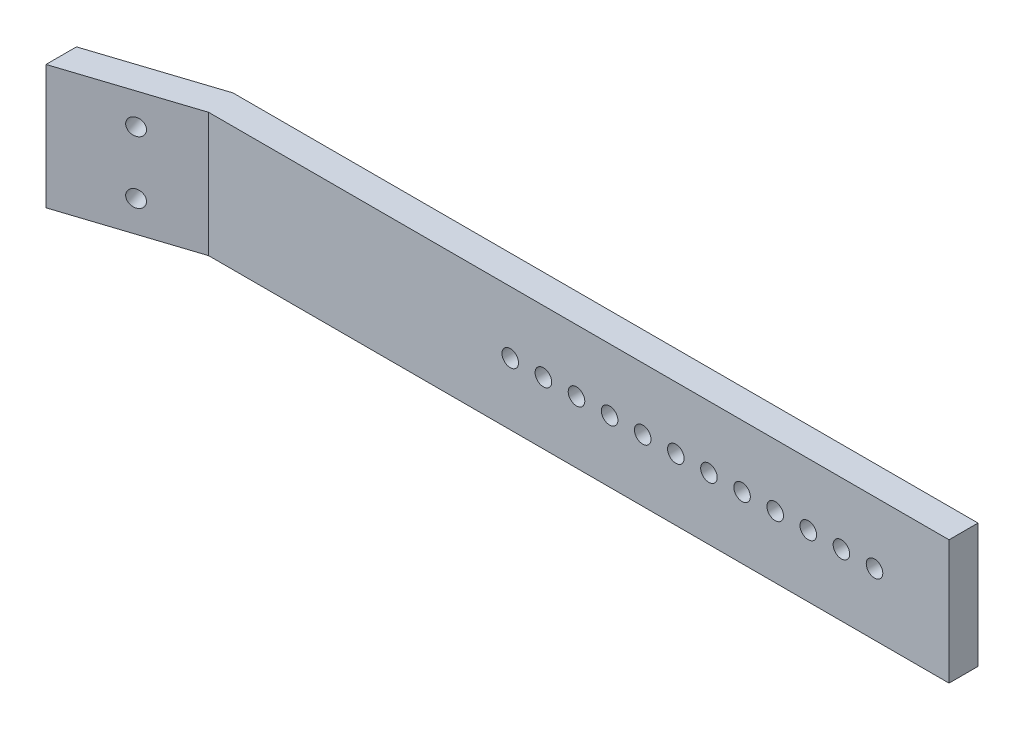
ISO-10303-21;
HEADER;
FILE_DESCRIPTION(('STEP AP214'),'2;1');
FILE_NAME('part.step','',(''),(''),'','','');
FILE_SCHEMA(('AUTOMOTIVE_DESIGN { 1 0 10303 214 1 1 1 1 }'));
ENDSEC;
DATA;
#1=APPLICATION_CONTEXT('core data for automotive mechanical design processes');
#2=APPLICATION_PROTOCOL_DEFINITION('international standard','automotive_design',2000,#1);
#3=PRODUCT_CONTEXT('',#1,'mechanical');
#4=PRODUCT('Part','Part','',(#3));
#5=PRODUCT_RELATED_PRODUCT_CATEGORY('part','',(#4));
#6=PRODUCT_DEFINITION_FORMATION('','',#4);
#7=PRODUCT_DEFINITION_CONTEXT('part definition',#1,'design');
#8=PRODUCT_DEFINITION('design','',#6,#7);
#9=PRODUCT_DEFINITION_SHAPE('','',#8);
#10=(LENGTH_UNIT() NAMED_UNIT(*) SI_UNIT(.MILLI.,.METRE.));
#11=(NAMED_UNIT(*) PLANE_ANGLE_UNIT() SI_UNIT($,.RADIAN.));
#12=(NAMED_UNIT(*) SI_UNIT($,.STERADIAN.) SOLID_ANGLE_UNIT());
#13=UNCERTAINTY_MEASURE_WITH_UNIT(LENGTH_MEASURE(1.E-05),#10,'distance_accuracy_value','');
#14=(GEOMETRIC_REPRESENTATION_CONTEXT(3) GLOBAL_UNCERTAINTY_ASSIGNED_CONTEXT((#13)) GLOBAL_UNIT_ASSIGNED_CONTEXT((#10,
#11,#12)) REPRESENTATION_CONTEXT('',''));
#15=CARTESIAN_POINT('',(0.,0.,0.));
#16=DIRECTION('',(0.,0.,1.));
#17=DIRECTION('',(1.,0.,0.));
#18=AXIS2_PLACEMENT_3D('',#15,#16,#17);
#19=CARTESIAN_POINT('',(-115.,15.,50.));
#20=DIRECTION('',(0.,-1.,0.));
#21=DIRECTION('',(0.,0.,-1.));
#22=AXIS2_PLACEMENT_3D('',#19,#20,#21);
#23=PLANE('',#22);
#24=DIRECTION('',(0.951056516295154,0.,-0.309016994374948));
#25=VECTOR('',#24,1.);
#26=CARTESIAN_POINT('',(-124.806977866667,15.,19.8172256703166));
#27=LINE('',#26,#25);
#28=CARTESIAN_POINT('',(-115.,15.,16.6307454009163));
#29=VERTEX_POINT('',#28);
#30=CARTESIAN_POINT('',(-85.3596134288735,15.,7.));
#31=VERTEX_POINT('',#30);
#32=EDGE_CURVE('E94',#29,#31,#27,.T.);
#33=ORIENTED_EDGE('',*,*,#32,.T.);
#34=DIRECTION('',(1.,0.,0.));
#35=VECTOR('',#34,1.);
#36=CARTESIAN_POINT('',(-115.,15.,7.00000000000001));
#37=LINE('',#36,#35);
#38=CARTESIAN_POINT('',(93.5316954888547,15.,7.));
#39=VERTEX_POINT('',#38);
#40=EDGE_CURVE('E177',#31,#39,#37,.T.);
#41=ORIENTED_EDGE('',*,*,#40,.T.);
#42=DIRECTION('',(0.,0.,-1.));
#43=VECTOR('',#42,1.);
#44=CARTESIAN_POINT('',(93.5316954888547,15.,50.0000000000002));
#45=LINE('',#44,#43);
#46=CARTESIAN_POINT('',(93.5316954888547,15.,0.));
#47=VERTEX_POINT('',#46);
#48=EDGE_CURVE('E183',#39,#47,#45,.T.);
#49=ORIENTED_EDGE('',*,*,#48,.T.);
#50=DIRECTION('',(-1.,0.,0.));
#51=VECTOR('',#50,1.);
#52=CARTESIAN_POINT('',(-115.,15.,0.));
#53=LINE('',#52,#51);
#54=CARTESIAN_POINT('',(-86.4683045111453,15.,0.));
#55=VERTEX_POINT('',#54);
#56=EDGE_CURVE('E117',#47,#55,#53,.T.);
#57=ORIENTED_EDGE('',*,*,#56,.T.);
#58=DIRECTION('',(-0.951056516295154,0.,0.309016994374948));
#59=VECTOR('',#58,1.);
#60=CARTESIAN_POINT('',(-126.970096827292,15.,13.1598300562506));
#61=LINE('',#60,#59);
#62=CARTESIAN_POINT('',(-115.,15.,9.27050983124845));
#63=VERTEX_POINT('',#62);
#64=EDGE_CURVE('E188',#55,#63,#61,.T.);
#65=ORIENTED_EDGE('',*,*,#64,.T.);
#66=DIRECTION('',(0.,0.,-1.));
#67=VECTOR('',#66,1.);
#68=CARTESIAN_POINT('',(-115.,15.,50.));
#69=LINE('',#68,#67);
#70=EDGE_CURVE('E111',#29,#63,#69,.T.);
#71=ORIENTED_EDGE('',*,*,#70,.F.);
#72=EDGE_LOOP('',(#33,#41,#49,#57,#65,#71));
#73=FACE_BOUND('',#72,.T.);
#74=ADVANCED_FACE('F34',(#73),#23,.F.);
#75=CARTESIAN_POINT('',(-115.,15.,50.));
#76=DIRECTION('',(1.,0.,0.));
#77=DIRECTION('',(0.,0.,-1.));
#78=AXIS2_PLACEMENT_3D('',#75,#76,#77);
#79=PLANE('',#78);
#80=DIRECTION('',(0.,0.,-1.));
#81=VECTOR('',#80,1.);
#82=CARTESIAN_POINT('',(-115.,-15.,50.));
#83=LINE('',#82,#81);
#84=CARTESIAN_POINT('',(-115.,-15.,16.6307454009163));
#85=VERTEX_POINT('',#84);
#86=CARTESIAN_POINT('',(-115.,-15.,9.27050983124845));
#87=VERTEX_POINT('',#86);
#88=EDGE_CURVE('E103',#85,#87,#83,.T.);
#89=ORIENTED_EDGE('',*,*,#88,.F.);
#90=DIRECTION('',(0.,-1.,0.));
#91=VECTOR('',#90,1.);
#92=CARTESIAN_POINT('',(-115.,35.,16.6307454009163));
#93=LINE('',#92,#91);
#94=EDGE_CURVE('E88',#29,#85,#93,.T.);
#95=ORIENTED_EDGE('',*,*,#94,.F.);
#96=ORIENTED_EDGE('',*,*,#70,.T.);
#97=DIRECTION('',(0.,-1.,0.));
#98=VECTOR('',#97,1.);
#99=CARTESIAN_POINT('',(-115.,35.,9.27050983124845));
#100=LINE('',#99,#98);
#101=EDGE_CURVE('E110',#63,#87,#100,.T.);
#102=ORIENTED_EDGE('',*,*,#101,.T.);
#103=EDGE_LOOP('',(#89,#95,#96,#102));
#104=FACE_BOUND('',#103,.T.);
#105=ADVANCED_FACE('F108',(#104),#79,.F.);
#106=CARTESIAN_POINT('',(-115.,-15.,50.));
#107=DIRECTION('',(0.,1.,0.));
#108=DIRECTION('',(0.,0.,1.));
#109=AXIS2_PLACEMENT_3D('',#106,#107,#108);
#110=PLANE('',#109);
#111=DIRECTION('',(0.,0.,-1.));
#112=VECTOR('',#111,1.);
#113=CARTESIAN_POINT('',(93.5316954888547,-15.,0.));
#114=LINE('',#113,#112);
#115=CARTESIAN_POINT('',(93.5316954888547,-15.,7.));
#116=VERTEX_POINT('',#115);
#117=CARTESIAN_POINT('',(93.5316954888546,-15.,0.));
#118=VERTEX_POINT('',#117);
#119=EDGE_CURVE('E56',#116,#118,#114,.T.);
#120=ORIENTED_EDGE('',*,*,#119,.F.);
#121=DIRECTION('',(1.,0.,0.));
#122=VECTOR('',#121,1.);
#123=CARTESIAN_POINT('',(-85.3596134288735,-15.,7.));
#124=LINE('',#123,#122);
#125=CARTESIAN_POINT('',(-85.3596134288735,-15.,7.));
#126=VERTEX_POINT('',#125);
#127=EDGE_CURVE('E50',#126,#116,#124,.T.);
#128=ORIENTED_EDGE('',*,*,#127,.F.);
#129=DIRECTION('',(0.951056516295153,0.,-0.309016994374948));
#130=VECTOR('',#129,1.);
#131=CARTESIAN_POINT('',(-115.,-15.,16.6307454009163));
#132=LINE('',#131,#130);
#133=EDGE_CURVE('E92',#85,#126,#132,.T.);
#134=ORIENTED_EDGE('',*,*,#133,.F.);
#135=ORIENTED_EDGE('',*,*,#88,.T.);
#136=DIRECTION('',(-0.951056516295153,0.,0.309016994374948));
#137=VECTOR('',#136,1.);
#138=CARTESIAN_POINT('',(-115.,-15.,9.27050983124845));
#139=LINE('',#138,#137);
#140=CARTESIAN_POINT('',(-86.4683045111453,-15.,0.));
#141=VERTEX_POINT('',#140);
#142=EDGE_CURVE('E185',#141,#87,#139,.T.);
#143=ORIENTED_EDGE('',*,*,#142,.F.);
#144=DIRECTION('',(1.,0.,0.));
#145=VECTOR('',#144,1.);
#146=CARTESIAN_POINT('',(-115.,-15.,0.));
#147=LINE('',#146,#145);
#148=EDGE_CURVE('E112',#141,#118,#147,.T.);
#149=ORIENTED_EDGE('',*,*,#148,.T.);
#150=EDGE_LOOP('',(#120,#128,#134,#135,#143,#149));
#151=FACE_BOUND('',#150,.T.);
#152=ADVANCED_FACE('F101',(#151),#110,.F.);
#153=CARTESIAN_POINT('',(0.,0.,0.));
#154=DIRECTION('',(0.,0.,1.));
#155=DIRECTION('',(1.,0.,0.));
#156=AXIS2_PLACEMENT_3D('',#153,#154,#155);
#157=PLANE('',#156);
#158=CARTESIAN_POINT('',(-12.4683045111453,0.,0.));
#159=DIRECTION('',(0.,0.,-1.));
#160=DIRECTION('',(-1.,0.,0.));
#161=AXIS2_PLACEMENT_3D('',#158,#159,#160);
#162=CIRCLE('',#161,2.);
#163=CARTESIAN_POINT('',(-14.4683045111453,0.,0.));
#164=VERTEX_POINT('',#163);
#165=EDGE_CURVE('E392',#164,#164,#162,.T.);
#166=ORIENTED_EDGE('',*,*,#165,.F.);
#167=EDGE_LOOP('',(#166));
#168=FACE_BOUND('',#167,.T.);
#169=CARTESIAN_POINT('',(-4.46830451114529,0.,0.));
#170=DIRECTION('',(0.,0.,-1.));
#171=DIRECTION('',(-1.,0.,0.));
#172=AXIS2_PLACEMENT_3D('',#169,#170,#171);
#173=CIRCLE('',#172,2.);
#174=CARTESIAN_POINT('',(-6.46830451114529,0.,0.));
#175=VERTEX_POINT('',#174);
#176=EDGE_CURVE('E393',#175,#175,#173,.T.);
#177=ORIENTED_EDGE('',*,*,#176,.F.);
#178=EDGE_LOOP('',(#177));
#179=FACE_BOUND('',#178,.T.);
#180=CARTESIAN_POINT('',(3.53169548885471,0.,0.));
#181=DIRECTION('',(0.,0.,-1.));
#182=DIRECTION('',(-1.,0.,0.));
#183=AXIS2_PLACEMENT_3D('',#180,#181,#182);
#184=CIRCLE('',#183,2.);
#185=CARTESIAN_POINT('',(1.53169548885471,0.,0.));
#186=VERTEX_POINT('',#185);
#187=EDGE_CURVE('E396',#186,#186,#184,.T.);
#188=ORIENTED_EDGE('',*,*,#187,.F.);
#189=EDGE_LOOP('',(#188));
#190=FACE_BOUND('',#189,.T.);
#191=CARTESIAN_POINT('',(11.5316954888547,0.,0.));
#192=DIRECTION('',(0.,0.,-1.));
#193=DIRECTION('',(-1.,0.,0.));
#194=AXIS2_PLACEMENT_3D('',#191,#192,#193);
#195=CIRCLE('',#194,2.);
#196=CARTESIAN_POINT('',(9.53169548885472,0.,0.));
#197=VERTEX_POINT('',#196);
#198=EDGE_CURVE('E422',#197,#197,#195,.T.);
#199=ORIENTED_EDGE('',*,*,#198,.F.);
#200=EDGE_LOOP('',(#199));
#201=FACE_BOUND('',#200,.T.);
#202=CARTESIAN_POINT('',(19.5316954888547,0.,0.));
#203=DIRECTION('',(0.,0.,-1.));
#204=DIRECTION('',(-1.,0.,0.));
#205=AXIS2_PLACEMENT_3D('',#202,#203,#204);
#206=CIRCLE('',#205,2.);
#207=CARTESIAN_POINT('',(17.5316954888547,0.,0.));
#208=VERTEX_POINT('',#207);
#209=EDGE_CURVE('E419',#208,#208,#206,.T.);
#210=ORIENTED_EDGE('',*,*,#209,.F.);
#211=EDGE_LOOP('',(#210));
#212=FACE_BOUND('',#211,.T.);
#213=CARTESIAN_POINT('',(27.5316954888547,0.,0.));
#214=DIRECTION('',(0.,0.,-1.));
#215=DIRECTION('',(-1.,0.,0.));
#216=AXIS2_PLACEMENT_3D('',#213,#214,#215);
#217=CIRCLE('',#216,2.);
#218=CARTESIAN_POINT('',(25.5316954888547,0.,0.));
#219=VERTEX_POINT('',#218);
#220=EDGE_CURVE('E416',#219,#219,#217,.T.);
#221=ORIENTED_EDGE('',*,*,#220,.F.);
#222=EDGE_LOOP('',(#221));
#223=FACE_BOUND('',#222,.T.);
#224=CARTESIAN_POINT('',(35.5316954888547,0.,0.));
#225=DIRECTION('',(0.,0.,-1.));
#226=DIRECTION('',(-1.,0.,0.));
#227=AXIS2_PLACEMENT_3D('',#224,#225,#226);
#228=CIRCLE('',#227,2.);
#229=CARTESIAN_POINT('',(33.5316954888547,0.,0.));
#230=VERTEX_POINT('',#229);
#231=EDGE_CURVE('E413',#230,#230,#228,.T.);
#232=ORIENTED_EDGE('',*,*,#231,.F.);
#233=EDGE_LOOP('',(#232));
#234=FACE_BOUND('',#233,.T.);
#235=CARTESIAN_POINT('',(59.5316954888547,0.,0.));
#236=DIRECTION('',(0.,0.,-1.));
#237=DIRECTION('',(-1.,0.,0.));
#238=AXIS2_PLACEMENT_3D('',#235,#236,#237);
#239=CIRCLE('',#238,2.);
#240=CARTESIAN_POINT('',(57.5316954888547,0.,0.));
#241=VERTEX_POINT('',#240);
#242=EDGE_CURVE('E400',#241,#241,#239,.T.);
#243=ORIENTED_EDGE('',*,*,#242,.F.);
#244=EDGE_LOOP('',(#243));
#245=FACE_BOUND('',#244,.T.);
#246=CARTESIAN_POINT('',(67.5316954888547,0.,0.));
#247=DIRECTION('',(0.,0.,-1.));
#248=DIRECTION('',(-1.,0.,0.));
#249=AXIS2_PLACEMENT_3D('',#246,#247,#248);
#250=CIRCLE('',#249,2.);
#251=CARTESIAN_POINT('',(65.5316954888547,0.,0.));
#252=VERTEX_POINT('',#251);
#253=EDGE_CURVE('E403',#252,#252,#250,.T.);
#254=ORIENTED_EDGE('',*,*,#253,.F.);
#255=EDGE_LOOP('',(#254));
#256=FACE_BOUND('',#255,.T.);
#257=CARTESIAN_POINT('',(75.5316954888547,0.,0.));
#258=DIRECTION('',(0.,0.,-1.));
#259=DIRECTION('',(-1.,0.,0.));
#260=AXIS2_PLACEMENT_3D('',#257,#258,#259);
#261=CIRCLE('',#260,2.);
#262=CARTESIAN_POINT('',(73.5316954888547,0.,0.));
#263=VERTEX_POINT('',#262);
#264=EDGE_CURVE('E407',#263,#263,#261,.T.);
#265=ORIENTED_EDGE('',*,*,#264,.F.);
#266=EDGE_LOOP('',(#265));
#267=FACE_BOUND('',#266,.T.);
#268=CARTESIAN_POINT('',(43.5316954888547,0.,0.));
#269=DIRECTION('',(0.,0.,-1.));
#270=DIRECTION('',(-1.,0.,0.));
#271=AXIS2_PLACEMENT_3D('',#268,#269,#270);
#272=CIRCLE('',#271,2.);
#273=CARTESIAN_POINT('',(41.5316954888547,0.,0.));
#274=VERTEX_POINT('',#273);
#275=EDGE_CURVE('E410',#274,#274,#272,.T.);
#276=ORIENTED_EDGE('',*,*,#275,.F.);
#277=EDGE_LOOP('',(#276));
#278=FACE_BOUND('',#277,.T.);
#279=CARTESIAN_POINT('',(51.5316954888547,0.,0.));
#280=DIRECTION('',(0.,0.,-1.));
#281=DIRECTION('',(-1.,0.,0.));
#282=AXIS2_PLACEMENT_3D('',#279,#280,#281);
#283=CIRCLE('',#282,2.);
#284=CARTESIAN_POINT('',(49.5316954888547,0.,0.));
#285=VERTEX_POINT('',#284);
#286=EDGE_CURVE('E134',#285,#285,#283,.T.);
#287=ORIENTED_EDGE('',*,*,#286,.F.);
#288=EDGE_LOOP('',(#287));
#289=FACE_BOUND('',#288,.T.);
#290=ORIENTED_EDGE('',*,*,#56,.F.);
#291=DIRECTION('',(0.,-1.,0.));
#292=VECTOR('',#291,1.);
#293=CARTESIAN_POINT('',(93.5316954888547,0.,0.));
#294=LINE('',#293,#292);
#295=EDGE_CURVE('E42',#47,#118,#294,.T.);
#296=ORIENTED_EDGE('',*,*,#295,.T.);
#297=ORIENTED_EDGE('',*,*,#148,.F.);
#298=DIRECTION('',(0.,1.,0.));
#299=VECTOR('',#298,1.);
#300=CARTESIAN_POINT('',(-86.4683045111453,0.,0.));
#301=LINE('',#300,#299);
#302=EDGE_CURVE('E114',#141,#55,#301,.T.);
#303=ORIENTED_EDGE('',*,*,#302,.T.);
#304=EDGE_LOOP('',(#290,#296,#297,#303));
#305=FACE_BOUND('',#304,.T.);
#306=ADVANCED_FACE('F198',(#168,#179,#190,#201,#212,#223,#234,#245,#256,#267,#278,#289,#305),
#157,.F.);
#307=CARTESIAN_POINT('',(-115.,35.,9.27050983124845));
#308=DIRECTION('',(0.309016994374948,0.,0.951056516295153));
#309=DIRECTION('',(0.951056516295153,0.,-0.309016994374948));
#310=AXIS2_PLACEMENT_3D('',#307,#308,#309);
#311=PLANE('',#310);
#312=CARTESIAN_POINT('',(-100.734152255573,7.50000000000001,4.63525491562421));
#313=DIRECTION('',(-0.309016994374948,0.,-0.951056516295153));
#314=DIRECTION('',(-0.951056516295153,0.,0.309016994374948));
#315=AXIS2_PLACEMENT_3D('',#312,#313,#314);
#316=CIRCLE('',#315,2.);
#317=CARTESIAN_POINT('',(-102.636265288163,7.50000000000001,5.25328890437411));
#318=VERTEX_POINT('',#317);
#319=EDGE_CURVE('E127',#318,#318,#316,.T.);
#320=ORIENTED_EDGE('',*,*,#319,.F.);
#321=EDGE_LOOP('',(#320));
#322=FACE_BOUND('',#321,.T.);
#323=CARTESIAN_POINT('',(-100.734152255573,-7.49999999999999,4.63525491562421));
#324=DIRECTION('',(-0.309016994374948,0.,-0.951056516295153));
#325=DIRECTION('',(-0.951056516295153,0.,0.309016994374948));
#326=AXIS2_PLACEMENT_3D('',#323,#324,#325);
#327=CIRCLE('',#326,2.);
#328=CARTESIAN_POINT('',(-102.636265288163,-7.49999999999999,5.25328890437411));
#329=VERTEX_POINT('',#328);
#330=EDGE_CURVE('E165',#329,#329,#327,.T.);
#331=ORIENTED_EDGE('',*,*,#330,.F.);
#332=EDGE_LOOP('',(#331));
#333=FACE_BOUND('',#332,.T.);
#334=ORIENTED_EDGE('',*,*,#302,.F.);
#335=ORIENTED_EDGE('',*,*,#142,.T.);
#336=ORIENTED_EDGE('',*,*,#101,.F.);
#337=ORIENTED_EDGE('',*,*,#64,.F.);
#338=EDGE_LOOP('',(#334,#335,#336,#337));
#339=FACE_BOUND('',#338,.T.);
#340=ADVANCED_FACE('F196',(#322,#333,#339),#311,.F.);
#341=CARTESIAN_POINT('',(93.5316954888547,35.,0.));
#342=DIRECTION('',(-1.,0.,0.));
#343=DIRECTION('',(0.,0.,1.));
#344=AXIS2_PLACEMENT_3D('',#341,#342,#343);
#345=PLANE('',#344);
#346=ORIENTED_EDGE('',*,*,#48,.F.);
#347=DIRECTION('',(0.,-1.,0.));
#348=VECTOR('',#347,1.);
#349=CARTESIAN_POINT('',(93.5316954888547,35.,7.));
#350=LINE('',#349,#348);
#351=EDGE_CURVE('E11',#39,#116,#350,.T.);
#352=ORIENTED_EDGE('',*,*,#351,.T.);
#353=ORIENTED_EDGE('',*,*,#119,.T.);
#354=ORIENTED_EDGE('',*,*,#295,.F.);
#355=EDGE_LOOP('',(#346,#352,#353,#354));
#356=FACE_BOUND('',#355,.T.);
#357=ADVANCED_FACE('F199',(#356),#345,.F.);
#358=CARTESIAN_POINT('',(-115.,35.,16.6307454009163));
#359=DIRECTION('',(-0.309016994374948,0.,-0.951056516295153));
#360=DIRECTION('',(-0.951056516295153,0.,0.309016994374948));
#361=AXIS2_PLACEMENT_3D('',#358,#359,#360);
#362=PLANE('',#361);
#363=CARTESIAN_POINT('',(-98.5710332949479,7.50000000000001,11.2926505296903));
#364=DIRECTION('',(-0.309016994374948,0.,-0.951056516295153));
#365=DIRECTION('',(-0.951056516295153,0.,0.309016994374948));
#366=AXIS2_PLACEMENT_3D('',#363,#364,#365);
#367=CIRCLE('',#366,2.);
#368=CARTESIAN_POINT('',(-100.473146327538,7.50000000000001,11.9106845184402));
#369=VERTEX_POINT('',#368);
#370=EDGE_CURVE('E105',#369,#369,#367,.T.);
#371=ORIENTED_EDGE('',*,*,#370,.T.);
#372=EDGE_LOOP('',(#371));
#373=FACE_BOUND('',#372,.T.);
#374=CARTESIAN_POINT('',(-98.5710332949479,-7.49999999999999,11.2926505296903));
#375=DIRECTION('',(-0.309016994374948,0.,-0.951056516295153));
#376=DIRECTION('',(-0.951056516295153,0.,0.309016994374948));
#377=AXIS2_PLACEMENT_3D('',#374,#375,#376);
#378=CIRCLE('',#377,2.);
#379=CARTESIAN_POINT('',(-100.473146327538,-7.49999999999999,11.9106845184402));
#380=VERTEX_POINT('',#379);
#381=EDGE_CURVE('E124',#380,#380,#378,.T.);
#382=ORIENTED_EDGE('',*,*,#381,.T.);
#383=EDGE_LOOP('',(#382));
#384=FACE_BOUND('',#383,.T.);
#385=ORIENTED_EDGE('',*,*,#94,.T.);
#386=ORIENTED_EDGE('',*,*,#133,.T.);
#387=DIRECTION('',(0.,-1.,0.));
#388=VECTOR('',#387,1.);
#389=CARTESIAN_POINT('',(-85.3596134288735,35.,7.));
#390=LINE('',#389,#388);
#391=EDGE_CURVE('E98',#31,#126,#390,.T.);
#392=ORIENTED_EDGE('',*,*,#391,.F.);
#393=ORIENTED_EDGE('',*,*,#32,.F.);
#394=EDGE_LOOP('',(#385,#386,#392,#393));
#395=FACE_BOUND('',#394,.T.);
#396=ADVANCED_FACE('F90',(#373,#384,#395),#362,.F.);
#397=CARTESIAN_POINT('',(-85.3596134288735,35.,7.));
#398=DIRECTION('',(0.,0.,-1.));
#399=DIRECTION('',(-1.,0.,0.));
#400=AXIS2_PLACEMENT_3D('',#397,#398,#399);
#401=PLANE('',#400);
#402=CARTESIAN_POINT('',(-12.4683045111453,0.,7.));
#403=DIRECTION('',(0.,0.,-1.));
#404=DIRECTION('',(-1.,0.,0.));
#405=AXIS2_PLACEMENT_3D('',#402,#403,#404);
#406=CIRCLE('',#405,2.);
#407=CARTESIAN_POINT('',(-14.4683045111453,0.,7.));
#408=VERTEX_POINT('',#407);
#409=EDGE_CURVE('E37',#408,#408,#406,.T.);
#410=ORIENTED_EDGE('',*,*,#409,.T.);
#411=EDGE_LOOP('',(#410));
#412=FACE_BOUND('',#411,.T.);
#413=CARTESIAN_POINT('',(-4.46830451114529,0.,7.));
#414=DIRECTION('',(0.,0.,-1.));
#415=DIRECTION('',(-1.,0.,0.));
#416=AXIS2_PLACEMENT_3D('',#413,#414,#415);
#417=CIRCLE('',#416,2.);
#418=CARTESIAN_POINT('',(-6.46830451114529,0.,7.));
#419=VERTEX_POINT('',#418);
#420=EDGE_CURVE('E160',#419,#419,#417,.T.);
#421=ORIENTED_EDGE('',*,*,#420,.T.);
#422=EDGE_LOOP('',(#421));
#423=FACE_BOUND('',#422,.T.);
#424=CARTESIAN_POINT('',(3.53169548885471,0.,7.));
#425=DIRECTION('',(0.,0.,-1.));
#426=DIRECTION('',(-1.,0.,0.));
#427=AXIS2_PLACEMENT_3D('',#424,#425,#426);
#428=CIRCLE('',#427,2.);
#429=CARTESIAN_POINT('',(1.53169548885471,0.,7.));
#430=VERTEX_POINT('',#429);
#431=EDGE_CURVE('E158',#430,#430,#428,.T.);
#432=ORIENTED_EDGE('',*,*,#431,.T.);
#433=EDGE_LOOP('',(#432));
#434=FACE_BOUND('',#433,.T.);
#435=CARTESIAN_POINT('',(11.5316954888547,0.,7.));
#436=DIRECTION('',(0.,0.,-1.));
#437=DIRECTION('',(-1.,0.,0.));
#438=AXIS2_PLACEMENT_3D('',#435,#436,#437);
#439=CIRCLE('',#438,2.);
#440=CARTESIAN_POINT('',(9.53169548885472,0.,7.));
#441=VERTEX_POINT('',#440);
#442=EDGE_CURVE('E155',#441,#441,#439,.T.);
#443=ORIENTED_EDGE('',*,*,#442,.T.);
#444=EDGE_LOOP('',(#443));
#445=FACE_BOUND('',#444,.T.);
#446=CARTESIAN_POINT('',(19.5316954888547,0.,7.));
#447=DIRECTION('',(0.,0.,-1.));
#448=DIRECTION('',(-1.,0.,0.));
#449=AXIS2_PLACEMENT_3D('',#446,#447,#448);
#450=CIRCLE('',#449,2.);
#451=CARTESIAN_POINT('',(17.5316954888547,0.,7.));
#452=VERTEX_POINT('',#451);
#453=EDGE_CURVE('E152',#452,#452,#450,.T.);
#454=ORIENTED_EDGE('',*,*,#453,.T.);
#455=EDGE_LOOP('',(#454));
#456=FACE_BOUND('',#455,.T.);
#457=CARTESIAN_POINT('',(27.5316954888547,0.,7.));
#458=DIRECTION('',(0.,0.,-1.));
#459=DIRECTION('',(-1.,0.,0.));
#460=AXIS2_PLACEMENT_3D('',#457,#458,#459);
#461=CIRCLE('',#460,2.);
#462=CARTESIAN_POINT('',(25.5316954888547,0.,7.));
#463=VERTEX_POINT('',#462);
#464=EDGE_CURVE('E149',#463,#463,#461,.T.);
#465=ORIENTED_EDGE('',*,*,#464,.T.);
#466=EDGE_LOOP('',(#465));
#467=FACE_BOUND('',#466,.T.);
#468=CARTESIAN_POINT('',(35.5316954888547,0.,7.));
#469=DIRECTION('',(0.,0.,-1.));
#470=DIRECTION('',(-1.,0.,0.));
#471=AXIS2_PLACEMENT_3D('',#468,#469,#470);
#472=CIRCLE('',#471,2.);
#473=CARTESIAN_POINT('',(33.5316954888547,0.,7.));
#474=VERTEX_POINT('',#473);
#475=EDGE_CURVE('E146',#474,#474,#472,.T.);
#476=ORIENTED_EDGE('',*,*,#475,.T.);
#477=EDGE_LOOP('',(#476));
#478=FACE_BOUND('',#477,.T.);
#479=CARTESIAN_POINT('',(59.5316954888547,0.,7.));
#480=DIRECTION('',(0.,0.,-1.));
#481=DIRECTION('',(-1.,0.,0.));
#482=AXIS2_PLACEMENT_3D('',#479,#480,#481);
#483=CIRCLE('',#482,2.);
#484=CARTESIAN_POINT('',(57.5316954888547,0.,7.));
#485=VERTEX_POINT('',#484);
#486=EDGE_CURVE('E143',#485,#485,#483,.T.);
#487=ORIENTED_EDGE('',*,*,#486,.T.);
#488=EDGE_LOOP('',(#487));
#489=FACE_BOUND('',#488,.T.);
#490=CARTESIAN_POINT('',(67.5316954888547,0.,7.));
#491=DIRECTION('',(0.,0.,-1.));
#492=DIRECTION('',(-1.,0.,0.));
#493=AXIS2_PLACEMENT_3D('',#490,#491,#492);
#494=CIRCLE('',#493,2.);
#495=CARTESIAN_POINT('',(65.5316954888547,0.,7.));
#496=VERTEX_POINT('',#495);
#497=EDGE_CURVE('E140',#496,#496,#494,.T.);
#498=ORIENTED_EDGE('',*,*,#497,.T.);
#499=EDGE_LOOP('',(#498));
#500=FACE_BOUND('',#499,.T.);
#501=CARTESIAN_POINT('',(75.5316954888547,0.,7.));
#502=DIRECTION('',(0.,0.,-1.));
#503=DIRECTION('',(-1.,0.,0.));
#504=AXIS2_PLACEMENT_3D('',#501,#502,#503);
#505=CIRCLE('',#504,2.);
#506=CARTESIAN_POINT('',(73.5316954888547,0.,7.));
#507=VERTEX_POINT('',#506);
#508=EDGE_CURVE('E137',#507,#507,#505,.T.);
#509=ORIENTED_EDGE('',*,*,#508,.T.);
#510=EDGE_LOOP('',(#509));
#511=FACE_BOUND('',#510,.T.);
#512=CARTESIAN_POINT('',(43.5316954888547,0.,7.));
#513=DIRECTION('',(0.,0.,-1.));
#514=DIRECTION('',(-1.,0.,0.));
#515=AXIS2_PLACEMENT_3D('',#512,#513,#514);
#516=CIRCLE('',#515,2.);
#517=CARTESIAN_POINT('',(41.5316954888547,0.,7.));
#518=VERTEX_POINT('',#517);
#519=EDGE_CURVE('E133',#518,#518,#516,.T.);
#520=ORIENTED_EDGE('',*,*,#519,.T.);
#521=EDGE_LOOP('',(#520));
#522=FACE_BOUND('',#521,.T.);
#523=CARTESIAN_POINT('',(51.5316954888547,0.,7.));
#524=DIRECTION('',(0.,0.,-1.));
#525=DIRECTION('',(-1.,0.,0.));
#526=AXIS2_PLACEMENT_3D('',#523,#524,#525);
#527=CIRCLE('',#526,2.);
#528=CARTESIAN_POINT('',(49.5316954888547,0.,7.));
#529=VERTEX_POINT('',#528);
#530=EDGE_CURVE('E130',#529,#529,#527,.T.);
#531=ORIENTED_EDGE('',*,*,#530,.T.);
#532=EDGE_LOOP('',(#531));
#533=FACE_BOUND('',#532,.T.);
#534=ORIENTED_EDGE('',*,*,#391,.T.);
#535=ORIENTED_EDGE('',*,*,#127,.T.);
#536=ORIENTED_EDGE('',*,*,#351,.F.);
#537=ORIENTED_EDGE('',*,*,#40,.F.);
#538=EDGE_LOOP('',(#534,#535,#536,#537));
#539=FACE_BOUND('',#538,.T.);
#540=ADVANCED_FACE('F200',(#412,#423,#434,#445,#456,#467,#478,#489,#500,#511,#522,#533,#539),
#401,.F.);
#541=CARTESIAN_POINT('',(-85.2833025368251,-7.49999999999999,52.1880807303819));
#542=DIRECTION('',(-0.309016994374948,0.,-0.951056516295153));
#543=DIRECTION('',(-0.951056516295153,0.,0.309016994374948));
#544=AXIS2_PLACEMENT_3D('',#541,#542,#543);
#545=CYLINDRICAL_SURFACE('',#544,2.);
#546=ORIENTED_EDGE('',*,*,#330,.T.);
#547=EDGE_LOOP('',(#546));
#548=FACE_BOUND('',#547,.T.);
#549=ORIENTED_EDGE('',*,*,#381,.F.);
#550=EDGE_LOOP('',(#549));
#551=FACE_BOUND('',#550,.T.);
#552=ADVANCED_FACE('F202',(#548,#551),#545,.F.);
#553=CARTESIAN_POINT('',(-85.2833025368251,7.50000000000001,52.1880807303819));
#554=DIRECTION('',(-0.309016994374948,0.,-0.951056516295153));
#555=DIRECTION('',(-0.951056516295153,0.,0.309016994374948));
#556=AXIS2_PLACEMENT_3D('',#553,#554,#555);
#557=CYLINDRICAL_SURFACE('',#556,2.);
#558=ORIENTED_EDGE('',*,*,#319,.T.);
#559=EDGE_LOOP('',(#558));
#560=FACE_BOUND('',#559,.T.);
#561=ORIENTED_EDGE('',*,*,#370,.F.);
#562=EDGE_LOOP('',(#561));
#563=FACE_BOUND('',#562,.T.);
#564=ADVANCED_FACE('F208',(#560,#563),#557,.F.);
#565=CARTESIAN_POINT('',(51.5316954888547,0.,50.));
#566=DIRECTION('',(0.,0.,-1.));
#567=DIRECTION('',(-1.,0.,0.));
#568=AXIS2_PLACEMENT_3D('',#565,#566,#567);
#569=CYLINDRICAL_SURFACE('',#568,2.);
#570=ORIENTED_EDGE('',*,*,#286,.T.);
#571=EDGE_LOOP('',(#570));
#572=FACE_BOUND('',#571,.T.);
#573=ORIENTED_EDGE('',*,*,#530,.F.);
#574=EDGE_LOOP('',(#573));
#575=FACE_BOUND('',#574,.T.);
#576=ADVANCED_FACE('F255',(#572,#575),#569,.F.);
#577=CARTESIAN_POINT('',(43.5316954888547,0.,50.));
#578=DIRECTION('',(0.,0.,-1.));
#579=DIRECTION('',(-1.,0.,0.));
#580=AXIS2_PLACEMENT_3D('',#577,#578,#579);
#581=CYLINDRICAL_SURFACE('',#580,2.);
#582=ORIENTED_EDGE('',*,*,#275,.T.);
#583=EDGE_LOOP('',(#582));
#584=FACE_BOUND('',#583,.T.);
#585=ORIENTED_EDGE('',*,*,#519,.F.);
#586=EDGE_LOOP('',(#585));
#587=FACE_BOUND('',#586,.T.);
#588=ADVANCED_FACE('F275',(#584,#587),#581,.F.);
#589=CARTESIAN_POINT('',(75.5316954888547,0.,50.));
#590=DIRECTION('',(0.,0.,-1.));
#591=DIRECTION('',(-1.,0.,0.));
#592=AXIS2_PLACEMENT_3D('',#589,#590,#591);
#593=CYLINDRICAL_SURFACE('',#592,2.);
#594=ORIENTED_EDGE('',*,*,#264,.T.);
#595=EDGE_LOOP('',(#594));
#596=FACE_BOUND('',#595,.T.);
#597=ORIENTED_EDGE('',*,*,#508,.F.);
#598=EDGE_LOOP('',(#597));
#599=FACE_BOUND('',#598,.T.);
#600=ADVANCED_FACE('F285',(#596,#599),#593,.F.);
#601=CARTESIAN_POINT('',(67.5316954888547,0.,50.));
#602=DIRECTION('',(0.,0.,-1.));
#603=DIRECTION('',(-1.,0.,0.));
#604=AXIS2_PLACEMENT_3D('',#601,#602,#603);
#605=CYLINDRICAL_SURFACE('',#604,2.);
#606=ORIENTED_EDGE('',*,*,#253,.T.);
#607=EDGE_LOOP('',(#606));
#608=FACE_BOUND('',#607,.T.);
#609=ORIENTED_EDGE('',*,*,#497,.F.);
#610=EDGE_LOOP('',(#609));
#611=FACE_BOUND('',#610,.T.);
#612=ADVANCED_FACE('F295',(#608,#611),#605,.F.);
#613=CARTESIAN_POINT('',(59.5316954888547,0.,50.));
#614=DIRECTION('',(0.,0.,-1.));
#615=DIRECTION('',(-1.,0.,0.));
#616=AXIS2_PLACEMENT_3D('',#613,#614,#615);
#617=CYLINDRICAL_SURFACE('',#616,2.);
#618=ORIENTED_EDGE('',*,*,#242,.T.);
#619=EDGE_LOOP('',(#618));
#620=FACE_BOUND('',#619,.T.);
#621=ORIENTED_EDGE('',*,*,#486,.F.);
#622=EDGE_LOOP('',(#621));
#623=FACE_BOUND('',#622,.T.);
#624=ADVANCED_FACE('F305',(#620,#623),#617,.F.);
#625=CARTESIAN_POINT('',(35.5316954888547,0.,50.));
#626=DIRECTION('',(0.,0.,-1.));
#627=DIRECTION('',(-1.,0.,0.));
#628=AXIS2_PLACEMENT_3D('',#625,#626,#627);
#629=CYLINDRICAL_SURFACE('',#628,2.);
#630=ORIENTED_EDGE('',*,*,#231,.T.);
#631=EDGE_LOOP('',(#630));
#632=FACE_BOUND('',#631,.T.);
#633=ORIENTED_EDGE('',*,*,#475,.F.);
#634=EDGE_LOOP('',(#633));
#635=FACE_BOUND('',#634,.T.);
#636=ADVANCED_FACE('F315',(#632,#635),#629,.F.);
#637=CARTESIAN_POINT('',(27.5316954888547,0.,50.));
#638=DIRECTION('',(0.,0.,-1.));
#639=DIRECTION('',(-1.,0.,0.));
#640=AXIS2_PLACEMENT_3D('',#637,#638,#639);
#641=CYLINDRICAL_SURFACE('',#640,2.);
#642=ORIENTED_EDGE('',*,*,#220,.T.);
#643=EDGE_LOOP('',(#642));
#644=FACE_BOUND('',#643,.T.);
#645=ORIENTED_EDGE('',*,*,#464,.F.);
#646=EDGE_LOOP('',(#645));
#647=FACE_BOUND('',#646,.T.);
#648=ADVANCED_FACE('F325',(#644,#647),#641,.F.);
#649=CARTESIAN_POINT('',(19.5316954888547,0.,50.));
#650=DIRECTION('',(0.,0.,-1.));
#651=DIRECTION('',(-1.,0.,0.));
#652=AXIS2_PLACEMENT_3D('',#649,#650,#651);
#653=CYLINDRICAL_SURFACE('',#652,2.);
#654=ORIENTED_EDGE('',*,*,#209,.T.);
#655=EDGE_LOOP('',(#654));
#656=FACE_BOUND('',#655,.T.);
#657=ORIENTED_EDGE('',*,*,#453,.F.);
#658=EDGE_LOOP('',(#657));
#659=FACE_BOUND('',#658,.T.);
#660=ADVANCED_FACE('F335',(#656,#659),#653,.F.);
#661=CARTESIAN_POINT('',(11.5316954888547,0.,50.));
#662=DIRECTION('',(0.,0.,-1.));
#663=DIRECTION('',(-1.,0.,0.));
#664=AXIS2_PLACEMENT_3D('',#661,#662,#663);
#665=CYLINDRICAL_SURFACE('',#664,2.);
#666=ORIENTED_EDGE('',*,*,#198,.T.);
#667=EDGE_LOOP('',(#666));
#668=FACE_BOUND('',#667,.T.);
#669=ORIENTED_EDGE('',*,*,#442,.F.);
#670=EDGE_LOOP('',(#669));
#671=FACE_BOUND('',#670,.T.);
#672=ADVANCED_FACE('F345',(#668,#671),#665,.F.);
#673=CARTESIAN_POINT('',(3.53169548885471,0.,50.));
#674=DIRECTION('',(0.,0.,-1.));
#675=DIRECTION('',(-1.,0.,0.));
#676=AXIS2_PLACEMENT_3D('',#673,#674,#675);
#677=CYLINDRICAL_SURFACE('',#676,2.);
#678=ORIENTED_EDGE('',*,*,#187,.T.);
#679=EDGE_LOOP('',(#678));
#680=FACE_BOUND('',#679,.T.);
#681=ORIENTED_EDGE('',*,*,#431,.F.);
#682=EDGE_LOOP('',(#681));
#683=FACE_BOUND('',#682,.T.);
#684=ADVANCED_FACE('F355',(#680,#683),#677,.F.);
#685=CARTESIAN_POINT('',(-4.46830451114529,0.,50.));
#686=DIRECTION('',(0.,0.,-1.));
#687=DIRECTION('',(-1.,0.,0.));
#688=AXIS2_PLACEMENT_3D('',#685,#686,#687);
#689=CYLINDRICAL_SURFACE('',#688,2.);
#690=ORIENTED_EDGE('',*,*,#176,.T.);
#691=EDGE_LOOP('',(#690));
#692=FACE_BOUND('',#691,.T.);
#693=ORIENTED_EDGE('',*,*,#420,.F.);
#694=EDGE_LOOP('',(#693));
#695=FACE_BOUND('',#694,.T.);
#696=ADVANCED_FACE('F365',(#692,#695),#689,.F.);
#697=CARTESIAN_POINT('',(-12.4683045111453,0.,50.));
#698=DIRECTION('',(0.,0.,-1.));
#699=DIRECTION('',(-1.,0.,0.));
#700=AXIS2_PLACEMENT_3D('',#697,#698,#699);
#701=CYLINDRICAL_SURFACE('',#700,2.);
#702=ORIENTED_EDGE('',*,*,#165,.T.);
#703=EDGE_LOOP('',(#702));
#704=FACE_BOUND('',#703,.T.);
#705=ORIENTED_EDGE('',*,*,#409,.F.);
#706=EDGE_LOOP('',(#705));
#707=FACE_BOUND('',#706,.T.);
#708=ADVANCED_FACE('F375',(#704,#707),#701,.F.);
#709=CLOSED_SHELL('',(#74,#105,#152,#306,#340,#357,#396,#540,#552,#564,#576,#588,#600,#612,#624,
#636,#648,#660,#672,#684,#696,#708));
#710=MANIFOLD_SOLID_BREP('B2',#709);
#711=ADVANCED_BREP_SHAPE_REPRESENTATION('',(#18,#710),#14);
#712=SHAPE_DEFINITION_REPRESENTATION(#9,#711);
ENDSEC;
END-ISO-10303-21;
